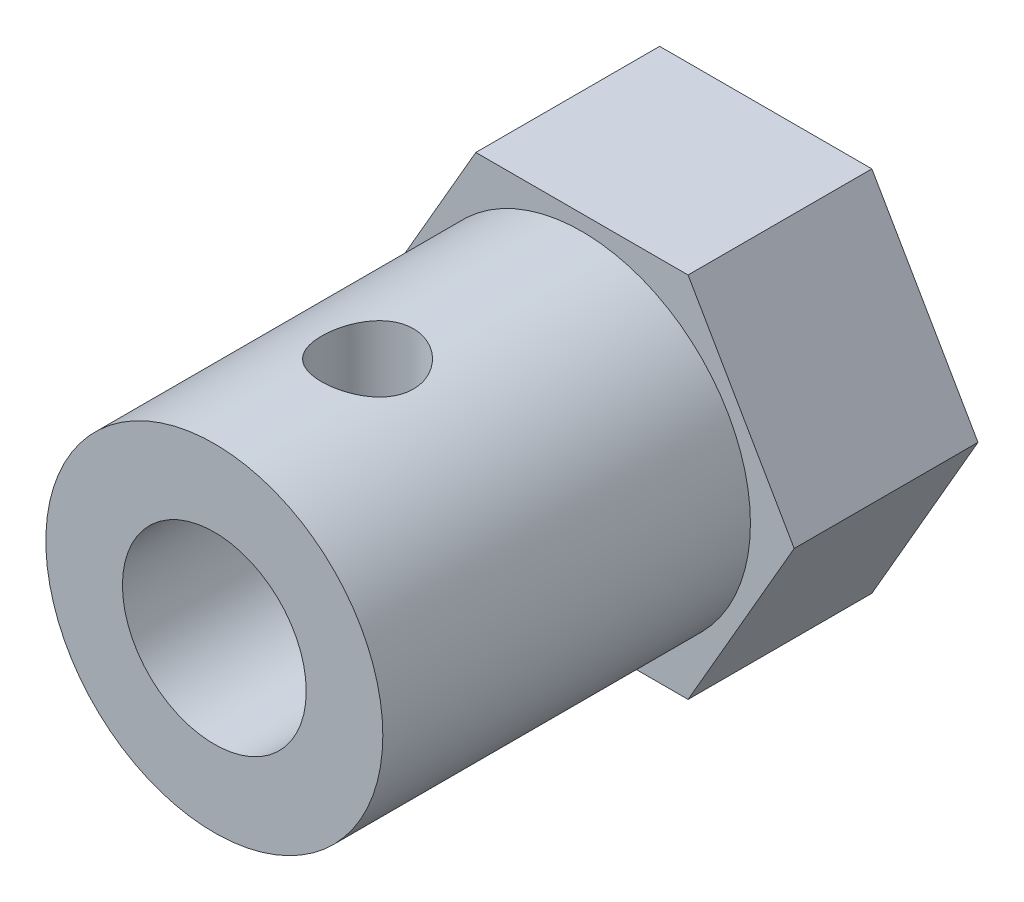
ISO-10303-21;
HEADER;
FILE_DESCRIPTION(('STEP AP214'),'2;1');
FILE_NAME('part.step','',(''),(''),'','','');
FILE_SCHEMA(('AUTOMOTIVE_DESIGN { 1 0 10303 214 1 1 1 1 }'));
ENDSEC;
DATA;
#1=APPLICATION_CONTEXT('core data for automotive mechanical design processes');
#2=APPLICATION_PROTOCOL_DEFINITION('international standard','automotive_design',2000,#1);
#3=PRODUCT_CONTEXT('',#1,'mechanical');
#4=PRODUCT('Part','Part','',(#3));
#5=PRODUCT_RELATED_PRODUCT_CATEGORY('part','',(#4));
#6=PRODUCT_DEFINITION_FORMATION('','',#4);
#7=PRODUCT_DEFINITION_CONTEXT('part definition',#1,'design');
#8=PRODUCT_DEFINITION('design','',#6,#7);
#9=PRODUCT_DEFINITION_SHAPE('','',#8);
#10=(LENGTH_UNIT() NAMED_UNIT(*) SI_UNIT(.MILLI.,.METRE.));
#11=(NAMED_UNIT(*) PLANE_ANGLE_UNIT() SI_UNIT($,.RADIAN.));
#12=(NAMED_UNIT(*) SI_UNIT($,.STERADIAN.) SOLID_ANGLE_UNIT());
#13=UNCERTAINTY_MEASURE_WITH_UNIT(LENGTH_MEASURE(1.E-05),#10,'distance_accuracy_value','');
#14=(GEOMETRIC_REPRESENTATION_CONTEXT(3) GLOBAL_UNCERTAINTY_ASSIGNED_CONTEXT((#13)) GLOBAL_UNIT_ASSIGNED_CONTEXT((#10,
#11,#12)) REPRESENTATION_CONTEXT('',''));
#15=CARTESIAN_POINT('',(0.,0.,0.));
#16=DIRECTION('',(0.,0.,1.));
#17=DIRECTION('',(1.,0.,0.));
#18=AXIS2_PLACEMENT_3D('',#15,#16,#17);
#19=CARTESIAN_POINT('',(0.,0.,18.));
#20=DIRECTION('',(0.,0.,-1.));
#21=DIRECTION('',(-1.,0.,0.));
#22=AXIS2_PLACEMENT_3D('',#19,#20,#21);
#23=CYLINDRICAL_SURFACE('',#22,5.5);
#24=CARTESIAN_POINT('',(0.,0.,18.));
#25=DIRECTION('',(0.,0.,1.));
#26=DIRECTION('',(1.,0.,0.));
#27=AXIS2_PLACEMENT_3D('',#24,#25,#26);
#28=CIRCLE('',#27,5.5);
#29=CARTESIAN_POINT('',(5.5,0.,18.));
#30=VERTEX_POINT('',#29);
#31=EDGE_CURVE('E128',#30,#30,#28,.T.);
#32=ORIENTED_EDGE('',*,*,#31,.F.);
#33=EDGE_LOOP('',(#32));
#34=FACE_BOUND('',#33,.T.);
#35=CARTESIAN_POINT('',(0.,0.,6.));
#36=DIRECTION('',(0.,0.,1.));
#37=DIRECTION('',(1.,0.,0.));
#38=AXIS2_PLACEMENT_3D('',#35,#36,#37);
#39=CIRCLE('',#38,5.5);
#40=CARTESIAN_POINT('',(5.5,0.,6.));
#41=VERTEX_POINT('',#40);
#42=EDGE_CURVE('E206',#41,#41,#39,.T.);
#43=ORIENTED_EDGE('',*,*,#42,.T.);
#44=EDGE_LOOP('',(#43));
#45=FACE_BOUND('',#44,.T.);
#46=CARTESIAN_POINT('',(0.,5.5,11.5));
#47=CARTESIAN_POINT('',(-0.0826209133321935,5.49999882717412,11.500001812611));
#48=CARTESIAN_POINT('',(-0.165260978812708,5.49812007260761,11.5068490635834));
#49=CARTESIAN_POINT('',(-0.328155930157697,5.49080798085451,11.5340058303032));
#50=CARTESIAN_POINT('',(-0.408409727977265,5.48537304740499,11.5543213916286));
#51=CARTESIAN_POINT('',(-0.564157626055394,5.47154772174135,11.6077017317384));
#52=CARTESIAN_POINT('',(-0.639657866970162,5.46316123869395,11.6407496526619));
#53=CARTESIAN_POINT('',(-0.784044496159719,5.44431654412848,11.7185929326624));
#54=CARTESIAN_POINT('',(-0.852930363289776,5.43385816956517,11.7633892163539));
#55=CARTESIAN_POINT('',(-0.983796947573261,5.41171397042059,11.8645998364673));
#56=CARTESIAN_POINT('',(-1.04559512916994,5.4000064149043,11.9212454408542));
#57=CARTESIAN_POINT('',(-1.15894293682478,5.37682112935063,12.0440526360299));
#58=CARTESIAN_POINT('',(-1.21049117824721,5.36534343055203,12.1102155104023));
#59=CARTESIAN_POINT('',(-1.30277794539497,5.34369384163659,12.2516512475795));
#60=CARTESIAN_POINT('',(-1.34330426837586,5.33354930058623,12.3270671449363));
#61=CARTESIAN_POINT('',(-1.41102916361228,5.31603507411917,12.4839638281994));
#62=CARTESIAN_POINT('',(-1.43823031946844,5.30866485085754,12.5654434348885));
#63=CARTESIAN_POINT('',(-1.47789456441268,5.2977584719274,12.7301278950125));
#64=CARTESIAN_POINT('',(-1.49068960543229,5.29413612283787,12.8132469481619));
#65=CARTESIAN_POINT('',(-1.50221364409134,5.29087829084083,12.9805246830088));
#66=CARTESIAN_POINT('',(-1.50094540140882,5.2912420257326,13.0646831575));
#67=CARTESIAN_POINT('',(-1.48464191780301,5.29583824875456,13.2290415509663));
#68=CARTESIAN_POINT('',(-1.47001073668932,5.29995718313671,13.3092852346022));
#69=CARTESIAN_POINT('',(-1.42804483871807,5.3114175579406,13.4661332860228));
#70=CARTESIAN_POINT('',(-1.40070906504647,5.31875926644153,13.5427373504663));
#71=CARTESIAN_POINT('',(-1.3337862982647,5.33593618292326,13.6911735205475));
#72=CARTESIAN_POINT('',(-1.29405951882948,5.34579959764141,13.7629392010336));
#73=CARTESIAN_POINT('',(-1.20357988022174,5.36689368797792,13.8989264474097));
#74=CARTESIAN_POINT('',(-1.15282476106209,5.37812464363249,13.9631464628387));
#75=CARTESIAN_POINT('',(-1.03967346682896,5.40115894990605,14.0845251898064));
#76=CARTESIAN_POINT('',(-0.976938646167252,5.41296874297114,14.1413674492889));
#77=CARTESIAN_POINT('',(-0.842682011788637,5.43548647707978,14.2437909649778));
#78=CARTESIAN_POINT('',(-0.771159819718555,5.44619437064292,14.2893717360496));
#79=CARTESIAN_POINT('',(-0.620853953739625,5.46537278121261,14.3681266727749));
#80=CARTESIAN_POINT('',(-0.542037637417774,5.47383251287305,14.4012413385839));
#81=CARTESIAN_POINT('',(-0.379672688714391,5.48748356142612,14.4536579725141));
#82=CARTESIAN_POINT('',(-0.296125144317683,5.49267562644564,14.4729631024441));
#83=CARTESIAN_POINT('',(-0.129368170483251,5.49909228776313,14.496710617797));
#84=CARTESIAN_POINT('',(-0.0462242977839804,5.50043163125371,14.5015829953204));
#85=CARTESIAN_POINT('',(0.119693365637972,5.49932301585136,14.4975172524866));
#86=CARTESIAN_POINT('',(0.202467195532507,5.49687546782998,14.4885806303835));
#87=CARTESIAN_POINT('',(0.363745097739555,5.48854239265957,14.4575024972969));
#88=CARTESIAN_POINT('',(0.442299324272676,5.48271986472129,14.435602807243));
#89=CARTESIAN_POINT('',(0.59460986744863,5.46829923535645,14.3795027553595));
#90=CARTESIAN_POINT('',(0.668365651304995,5.45970082634473,14.3453010303387));
#91=CARTESIAN_POINT('',(0.810641161194589,5.44041573828275,14.2647835577143));
#92=CARTESIAN_POINT('',(0.879024602412583,5.4296902954988,14.2182365127384));
#93=CARTESIAN_POINT('',(1.00716022013082,5.40738988410035,14.1146387124548));
#94=CARTESIAN_POINT('',(1.06691060617763,5.39581474001048,14.0575857838425));
#95=CARTESIAN_POINT('',(1.17791060344312,5.37269401558495,13.9325859619651));
#96=CARTESIAN_POINT('',(1.22885627747222,5.36115944983886,13.864366617721));
#97=CARTESIAN_POINT('',(1.3185858220796,5.33980026187814,13.7201013527807));
#98=CARTESIAN_POINT('',(1.35737017925923,5.32997557125461,13.6440557453925));
#99=CARTESIAN_POINT('',(1.42138558317209,5.31326248703816,13.486659371758));
#100=CARTESIAN_POINT('',(1.44669352306985,5.30635748202252,13.4053417394748));
#101=CARTESIAN_POINT('',(1.48320917220692,5.29626814696188,13.2393831619724));
#102=CARTESIAN_POINT('',(1.49442068863148,5.29308281231876,13.1547431204463));
#103=CARTESIAN_POINT('',(1.50219895576908,5.29088009671763,12.9876615961825));
#104=CARTESIAN_POINT('',(1.49925533217026,5.29172336001588,12.9052444112775));
#105=CARTESIAN_POINT('',(1.47994837643976,5.29715501736986,12.742129352265));
#106=CARTESIAN_POINT('',(1.46358542028567,5.30174330649891,12.661431430053));
#107=CARTESIAN_POINT('',(1.41819408435119,5.31406316491799,12.5046936842239));
#108=CARTESIAN_POINT('',(1.38927395449127,5.32176783125817,12.4286202467582));
#109=CARTESIAN_POINT('',(1.31967304541386,5.33945189987963,12.2823467231867));
#110=CARTESIAN_POINT('',(1.27899034504456,5.34943167369227,12.2121475989348));
#111=CARTESIAN_POINT('',(1.18555430984851,5.37092379381814,12.0772894023074));
#112=CARTESIAN_POINT('',(1.13246901822125,5.38247375845259,12.0128662951569));
#113=CARTESIAN_POINT('',(1.01636011199274,5.40559990490855,11.8936835932054));
#114=CARTESIAN_POINT('',(0.953334059387995,5.41717609247304,11.8389263759947));
#115=CARTESIAN_POINT('',(0.817407725686079,5.43936459177359,11.7394053854806));
#116=CARTESIAN_POINT('',(0.744315866262519,5.44994907753807,11.694896519133));
#117=CARTESIAN_POINT('',(0.591399899839279,5.46865263780403,11.6188675637885));
#118=CARTESIAN_POINT('',(0.511579952421221,5.47677322151197,11.5873395194457));
#119=CARTESIAN_POINT('',(0.360100101218211,5.48864193995757,11.542060490021));
#120=CARTESIAN_POINT('',(0.289064640262468,5.49286947681091,11.5263254487583));
#121=CARTESIAN_POINT('',(0.145357607941484,5.49854887164354,11.5052949746812));
#122=CARTESIAN_POINT('',(0.0726862155649467,5.5000010318002,11.4999984053452));
#123=CARTESIAN_POINT('',(0.,5.5,11.5));
#124=B_SPLINE_CURVE_WITH_KNOTS('',3,(#46,#47,#48,#49,#50,#51,#52,#53,#54,#55,#56,#57,#58,#59,
#60,#61,#62,#63,#64,#65,#66,#67,#68,#69,#70,#71,#72,#73,#74,#75,#76,#77,#78,#79,#80,#81,#82,#83,
#84,#85,#86,#87,#88,#89,#90,#91,#92,#93,#94,#95,#96,#97,#98,#99,#100,#101,#102,#103,#104,#105,
#106,#107,#108,#109,#110,#111,#112,#113,#114,#115,#116,#117,#118,#119,#120,#121,#122,#123),
.UNSPECIFIED.,.T.,.F.,(4,2,2,2,2,2,2,2,2,2,2,2,2,2,2,2,2,2,2,2,2,2,2,2,2,2,2,2,2,2,2,2,2,2,2,2,
2,2,4),(0.,0.247596106854897,0.4953034285513,0.742683902420578,0.990083851364705,
1.24285878223179,1.49566783659324,1.75304593650219,2.01037411390996,2.26164304860926,
2.51286267696538,2.75672886674887,3.00061534583717,3.24735926767928,3.49415380139121,
3.74938528550775,4.00462776284424,4.26107349736028,4.51746049766944,4.76612811343083,
5.0147687510525,5.25891111200195,5.50308053475836,5.75219469009681,6.00136043656003,
6.2579007306487,6.51443075867912,6.76948096455404,7.0244622712421,7.27068852228629,
7.51690787489588,7.76104555655817,8.00522313517586,8.25689011392092,8.50861891104974,
8.76605872289059,9.02334052607436,9.2411883209319,9.45901239561305),.UNSPECIFIED.);
#125=CARTESIAN_POINT('',(0.,5.5,11.5));
#126=VERTEX_POINT('',#125);
#127=EDGE_CURVE('E174',#126,#126,#124,.T.);
#128=ORIENTED_EDGE('',*,*,#127,.F.);
#129=EDGE_LOOP('',(#128));
#130=FACE_BOUND('',#129,.T.);
#131=ADVANCED_FACE('F34',(#34,#45,#130),#23,.T.);
#132=CARTESIAN_POINT('',(0.,0.,5.));
#133=DIRECTION('',(0.,0.,1.));
#134=DIRECTION('',(1.,0.,0.));
#135=AXIS2_PLACEMENT_3D('',#132,#133,#134);
#136=CYLINDRICAL_SURFACE('',#135,3.);
#137=CARTESIAN_POINT('',(0.,0.,5.));
#138=DIRECTION('',(0.,0.,1.));
#139=DIRECTION('',(1.,0.,0.));
#140=AXIS2_PLACEMENT_3D('',#137,#138,#139);
#141=CIRCLE('',#140,3.);
#142=CARTESIAN_POINT('',(3.,0.,5.));
#143=VERTEX_POINT('',#142);
#144=EDGE_CURVE('E205',#143,#143,#141,.T.);
#145=ORIENTED_EDGE('',*,*,#144,.F.);
#146=EDGE_LOOP('',(#145));
#147=FACE_BOUND('',#146,.T.);
#148=CARTESIAN_POINT('',(0.,0.,18.));
#149=DIRECTION('',(0.,0.,1.));
#150=DIRECTION('',(1.,0.,0.));
#151=AXIS2_PLACEMENT_3D('',#148,#149,#150);
#152=CIRCLE('',#151,3.);
#153=CARTESIAN_POINT('',(3.,0.,18.));
#154=VERTEX_POINT('',#153);
#155=EDGE_CURVE('E207',#154,#154,#152,.T.);
#156=ORIENTED_EDGE('',*,*,#155,.T.);
#157=EDGE_LOOP('',(#156));
#158=FACE_BOUND('',#157,.T.);
#159=CARTESIAN_POINT('',(0.,3.,11.5));
#160=CARTESIAN_POINT('',(0.0788579444268502,2.99999570107561,11.5000049534758));
#161=CARTESIAN_POINT('',(0.157809899546344,2.99685736529634,11.5062551096816));
#162=CARTESIAN_POINT('',(0.313380352903344,2.98461234055736,11.5309793205123));
#163=CARTESIAN_POINT('',(0.389994130070444,2.97549431743379,11.5494765894967));
#164=CARTESIAN_POINT('',(0.538400317320673,2.95224419105063,11.5977907129249));
#165=CARTESIAN_POINT('',(0.610210204408719,2.93813158766306,11.627563576372));
#166=CARTESIAN_POINT('',(0.747708925209898,2.90618664773642,11.6973559320475));
#167=CARTESIAN_POINT('',(0.813398240985089,2.88835460450288,11.7373746163733));
#168=CARTESIAN_POINT('',(0.941261726642864,2.84934387387093,11.8292758742279));
#169=CARTESIAN_POINT('',(1.00298281668316,2.82802798691306,11.8817297188595));
#170=CARTESIAN_POINT('',(1.11716916730047,2.78489955370115,11.9957822188706));
#171=CARTESIAN_POINT('',(1.16962737466015,2.76308664313552,12.0573877776587));
#172=CARTESIAN_POINT('',(1.26787800067542,2.71948426796021,12.1937250242851));
#173=CARTESIAN_POINT('',(1.31283800332745,2.69782780455198,12.2691041475189));
#174=CARTESIAN_POINT('',(1.38925234033604,2.65928968158481,12.4275510039793));
#175=CARTESIAN_POINT('',(1.4207163224495,2.64240461410484,12.5106131930841));
#176=CARTESIAN_POINT('',(1.46719866328288,2.61686800556713,12.6769976581329));
#177=CARTESIAN_POINT('',(1.48308878562066,2.6077840737557,12.7600066781011));
#178=CARTESIAN_POINT('',(1.50064048996327,2.59772834922792,12.9279682566692));
#179=CARTESIAN_POINT('',(1.50231613255961,2.59674854014932,13.0129188113067));
#180=CARTESIAN_POINT('',(1.49203093075844,2.60266395385873,13.1714290364731));
#181=CARTESIAN_POINT('',(1.48167683930523,2.6086314549302,13.2451360468346));
#182=CARTESIAN_POINT('',(1.4504097735854,2.62614343100775,13.3895828640596));
#183=CARTESIAN_POINT('',(1.42949343584648,2.63768968247664,13.460321717958));
#184=CARTESIAN_POINT('',(1.37731467057901,2.66531214619112,13.5988436988485));
#185=CARTESIAN_POINT('',(1.34582260067399,2.68148760995998,13.6665195981787));
#186=CARTESIAN_POINT('',(1.273562531502,2.71655106422106,13.795951438885));
#187=CARTESIAN_POINT('',(1.2327903657187,2.73544027170286,13.8577047034001));
#188=CARTESIAN_POINT('',(1.13709908236918,2.77669736854929,13.9817818791148));
#189=CARTESIAN_POINT('',(1.08104168755392,2.79920265355119,14.0431853103642));
#190=CARTESIAN_POINT('',(0.95933336811206,2.84321434950611,14.1561031278864));
#191=CARTESIAN_POINT('',(0.893677884861428,2.86472027938201,14.2076127880508));
#192=CARTESIAN_POINT('',(0.750774758747773,2.90552980924446,14.3015284915446));
#193=CARTESIAN_POINT('',(0.673130387399114,2.92468476243011,14.3434007086686));
#194=CARTESIAN_POINT('',(0.510699323233195,2.95736821681863,14.4131455435645));
#195=CARTESIAN_POINT('',(0.425918364397914,2.9709011841533,14.4410292775227));
#196=CARTESIAN_POINT('',(0.259149737491054,2.98986500612153,14.479713105575));
#197=CARTESIAN_POINT('',(0.177512295822489,2.99587407451965,14.4917368536202));
#198=CARTESIAN_POINT('',(0.0131693999240272,3.00109520188655,14.5021970967017));
#199=CARTESIAN_POINT('',(-0.0695355298048634,3.00031048081978,14.5006400284592));
#200=CARTESIAN_POINT('',(-0.22684945797898,2.99236788380152,14.4846899673719));
#201=CARTESIAN_POINT('',(-0.301589112074895,2.98570868532252,14.471301200905));
#202=CARTESIAN_POINT('',(-0.447610338452912,2.9673325697226,14.4336428921573));
#203=CARTESIAN_POINT('',(-0.518891528536631,2.95561509501618,14.4093721503198));
#204=CARTESIAN_POINT('',(-0.65833291267436,2.92776377120382,14.3500023003504));
#205=CARTESIAN_POINT('',(-0.726345595508705,2.91151322654446,14.3146134248256));
#206=CARTESIAN_POINT('',(-0.855692042548908,2.87615961476126,14.2343386965301));
#207=CARTESIAN_POINT('',(-0.917022944664888,2.85705533350407,14.1894487981069));
#208=CARTESIAN_POINT('',(-1.03765153393382,2.81562332004297,14.0863593620039));
#209=CARTESIAN_POINT('',(-1.09615811672854,2.79316327265249,14.0272856973323));
#210=CARTESIAN_POINT('',(-1.20278448167828,2.7489358741323,13.9001122730834));
#211=CARTESIAN_POINT('',(-1.25089707856781,2.72716901100071,13.8320063217281));
#212=CARTESIAN_POINT('',(-1.33756187171853,2.68576788309734,13.6845345187405));
#213=CARTESIAN_POINT('',(-1.37553824370037,2.66628794383591,13.6047831008583));
#214=CARTESIAN_POINT('',(-1.43712423890206,2.63361108441202,13.4387348986376));
#215=CARTESIAN_POINT('',(-1.46075237380052,2.62040607332625,13.3524467102997));
#216=CARTESIAN_POINT('',(-1.49079253120031,2.60342251538703,13.1846346656729));
#217=CARTESIAN_POINT('',(-1.49863949460818,2.59886075197597,13.1034486198471));
#218=CARTESIAN_POINT('',(-1.5010337315643,2.59748031962405,12.9408293992532));
#219=CARTESIAN_POINT('',(-1.49558676993486,2.60065829439585,12.8593963468932));
#220=CARTESIAN_POINT('',(-1.47288918838996,2.61356793076615,12.7067747476998));
#221=CARTESIAN_POINT('',(-1.45681247151455,2.62264641723988,12.6353492947829));
#222=CARTESIAN_POINT('',(-1.41476303733662,2.64556524281479,12.4962878208634));
#223=CARTESIAN_POINT('',(-1.38878713673988,2.65940711354503,12.428653026862));
#224=CARTESIAN_POINT('',(-1.32572361795085,2.69142795546804,12.2940627235202));
#225=CARTESIAN_POINT('',(-1.28800670672355,2.70983583593881,12.2274581472565));
#226=CARTESIAN_POINT('',(-1.20322645745609,2.74852997452291,12.1010881957281));
#227=CARTESIAN_POINT('',(-1.15615825686234,2.76881720693416,12.0413264042183));
#228=CARTESIAN_POINT('',(-1.04730498999206,2.81193484737138,11.922787026468));
#229=CARTESIAN_POINT('',(-0.984426634495891,2.83477474959942,11.8650113464746));
#230=CARTESIAN_POINT('',(-0.849232209349795,2.87816628389896,11.7606055248471));
#231=CARTESIAN_POINT('',(-0.776911084957795,2.89871667939293,11.7139813907951));
#232=CARTESIAN_POINT('',(-0.623897395174417,2.93547014349806,11.6331454559319));
#233=CARTESIAN_POINT('',(-0.543149255665094,2.95164144740899,11.5990237461453));
#234=CARTESIAN_POINT('',(-0.376113151707128,2.9775201194848,11.5452877483639));
#235=CARTESIAN_POINT('',(-0.289841699383648,2.98724585044602,11.5256322297914));
#236=CARTESIAN_POINT('',(-0.168902919736341,2.99543192870217,11.5091538833714));
#237=CARTESIAN_POINT('',(-0.135242819162346,2.99714048010376,11.5057260387005));
#238=CARTESIAN_POINT('',(-0.0677275977076369,2.99942545465223,11.5011480017289));
#239=CARTESIAN_POINT('',(-0.0338724714699424,3.00000184655071,11.4999978722947));
#240=CARTESIAN_POINT('',(0.,3.,11.5));
#241=B_SPLINE_CURVE_WITH_KNOTS('',3,(#159,#160,#161,#162,#163,#164,#165,#166,#167,#168,#169,
#170,#171,#172,#173,#174,#175,#176,#177,#178,#179,#180,#181,#182,#183,#184,#185,#186,#187,#188,
#189,#190,#191,#192,#193,#194,#195,#196,#197,#198,#199,#200,#201,#202,#203,#204,#205,#206,#207,
#208,#209,#210,#211,#212,#213,#214,#215,#216,#217,#218,#219,#220,#221,#222,#223,#224,#225,#226,
#227,#228,#229,#230,#231,#232,#233,#234,#235,#236,#237,#238,#239,#240),.UNSPECIFIED.,.T.,.F.,(4,
2,2,2,2,2,2,2,2,2,2,2,2,2,2,2,2,2,2,2,2,2,2,2,2,2,2,2,2,2,2,2,2,2,2,2,2,2,2,2,4),(0.,
0.236436386130439,0.473322224563796,0.709293233238447,0.945245640872351,1.19547263807713,
1.44588935648105,1.71572589646129,1.98536921847421,2.23887018210344,2.49212035993531,
2.7150856861398,2.93812205888518,3.16635360252731,3.39468781890333,3.65197412000818,
3.90938301898029,4.17874533321661,4.44789325368419,4.69474935707018,4.94148846767214,
5.16910359759183,5.39674382446397,5.63089284041848,5.86514176122509,6.12239415966628,
6.37982382923148,6.64972023242589,6.91926767918176,7.1629396125457,7.40650589797017,
7.62686895373284,7.84730293182526,8.08254685170431,8.31791341715446,8.58187864135757,
8.84598575071868,9.1119602049529,9.37717362931723,9.47872920200875,9.58028757766598),.UNSPECIFIED.);
#242=CARTESIAN_POINT('',(0.,3.,11.5));
#243=VERTEX_POINT('',#242);
#244=EDGE_CURVE('E38',#243,#243,#241,.T.);
#245=ORIENTED_EDGE('',*,*,#244,.F.);
#246=EDGE_LOOP('',(#245));
#247=FACE_BOUND('',#246,.T.);
#248=ADVANCED_FACE('F161',(#147,#158,#247),#136,.F.);
#249=CARTESIAN_POINT('',(3.46410161513776,-6.,6.));
#250=DIRECTION('',(-0.866025403784439,0.5,0.));
#251=DIRECTION('',(-0.5,-0.866025403784439,0.));
#252=AXIS2_PLACEMENT_3D('',#249,#250,#251);
#253=PLANE('',#252);
#254=DIRECTION('',(0.5,0.866025403784439,0.));
#255=VECTOR('',#254,1.);
#256=CARTESIAN_POINT('',(3.46410161513776,-6.,0.));
#257=LINE('',#256,#255);
#258=CARTESIAN_POINT('',(3.46410161513776,-6.,0.));
#259=VERTEX_POINT('',#258);
#260=CARTESIAN_POINT('',(6.92820323027551,0.,0.));
#261=VERTEX_POINT('',#260);
#262=EDGE_CURVE('E124',#259,#261,#257,.T.);
#263=ORIENTED_EDGE('',*,*,#262,.T.);
#264=DIRECTION('',(0.,0.,-1.));
#265=VECTOR('',#264,1.);
#266=CARTESIAN_POINT('',(6.92820323027551,0.,6.));
#267=LINE('',#266,#265);
#268=CARTESIAN_POINT('',(6.92820323027551,0.,6.));
#269=VERTEX_POINT('',#268);
#270=EDGE_CURVE('E11',#269,#261,#267,.T.);
#271=ORIENTED_EDGE('',*,*,#270,.F.);
#272=DIRECTION('',(0.5,0.866025403784439,0.));
#273=VECTOR('',#272,1.);
#274=CARTESIAN_POINT('',(3.46410161513776,-6.,6.));
#275=LINE('',#274,#273);
#276=CARTESIAN_POINT('',(3.46410161513776,-6.,6.));
#277=VERTEX_POINT('',#276);
#278=EDGE_CURVE('E135',#277,#269,#275,.T.);
#279=ORIENTED_EDGE('',*,*,#278,.F.);
#280=DIRECTION('',(0.,0.,-1.));
#281=VECTOR('',#280,1.);
#282=CARTESIAN_POINT('',(3.46410161513776,-6.,6.));
#283=LINE('',#282,#281);
#284=EDGE_CURVE('E120',#277,#259,#283,.T.);
#285=ORIENTED_EDGE('',*,*,#284,.T.);
#286=EDGE_LOOP('',(#263,#271,#279,#285));
#287=FACE_BOUND('',#286,.T.);
#288=ADVANCED_FACE('F36',(#287),#253,.F.);
#289=CARTESIAN_POINT('',(6.92820323027551,0.,6.));
#290=DIRECTION('',(-0.866025403784438,-0.5,0.));
#291=DIRECTION('',(0.5,-0.866025403784439,0.));
#292=AXIS2_PLACEMENT_3D('',#289,#290,#291);
#293=PLANE('',#292);
#294=DIRECTION('',(-0.5,0.866025403784439,0.));
#295=VECTOR('',#294,1.);
#296=CARTESIAN_POINT('',(6.92820323027551,0.,0.));
#297=LINE('',#296,#295);
#298=CARTESIAN_POINT('',(3.46410161513775,6.,0.));
#299=VERTEX_POINT('',#298);
#300=EDGE_CURVE('E127',#261,#299,#297,.T.);
#301=ORIENTED_EDGE('',*,*,#300,.T.);
#302=DIRECTION('',(0.,0.,-1.));
#303=VECTOR('',#302,1.);
#304=CARTESIAN_POINT('',(3.46410161513775,6.,6.));
#305=LINE('',#304,#303);
#306=CARTESIAN_POINT('',(3.46410161513775,6.,6.));
#307=VERTEX_POINT('',#306);
#308=EDGE_CURVE('E48',#307,#299,#305,.T.);
#309=ORIENTED_EDGE('',*,*,#308,.F.);
#310=DIRECTION('',(-0.5,0.866025403784439,0.));
#311=VECTOR('',#310,1.);
#312=CARTESIAN_POINT('',(6.92820323027551,0.,6.));
#313=LINE('',#312,#311);
#314=EDGE_CURVE('E93',#269,#307,#313,.T.);
#315=ORIENTED_EDGE('',*,*,#314,.F.);
#316=ORIENTED_EDGE('',*,*,#270,.T.);
#317=EDGE_LOOP('',(#301,#309,#315,#316));
#318=FACE_BOUND('',#317,.T.);
#319=ADVANCED_FACE('F263',(#318),#293,.F.);
#320=CARTESIAN_POINT('',(3.46410161513775,6.,6.));
#321=DIRECTION('',(0.,-1.,0.));
#322=DIRECTION('',(0.,0.,-1.));
#323=AXIS2_PLACEMENT_3D('',#320,#321,#322);
#324=PLANE('',#323);
#325=DIRECTION('',(-1.,0.,0.));
#326=VECTOR('',#325,1.);
#327=CARTESIAN_POINT('',(3.46410161513775,6.,0.));
#328=LINE('',#327,#326);
#329=CARTESIAN_POINT('',(-3.46410161513775,6.,0.));
#330=VERTEX_POINT('',#329);
#331=EDGE_CURVE('E130',#299,#330,#328,.T.);
#332=ORIENTED_EDGE('',*,*,#331,.T.);
#333=DIRECTION('',(0.,0.,-1.));
#334=VECTOR('',#333,1.);
#335=CARTESIAN_POINT('',(-3.46410161513775,6.,6.));
#336=LINE('',#335,#334);
#337=CARTESIAN_POINT('',(-3.46410161513775,6.,6.));
#338=VERTEX_POINT('',#337);
#339=EDGE_CURVE('E115',#338,#330,#336,.T.);
#340=ORIENTED_EDGE('',*,*,#339,.F.);
#341=DIRECTION('',(-1.,0.,0.));
#342=VECTOR('',#341,1.);
#343=CARTESIAN_POINT('',(3.46410161513775,6.,6.));
#344=LINE('',#343,#342);
#345=EDGE_CURVE('E106',#307,#338,#344,.T.);
#346=ORIENTED_EDGE('',*,*,#345,.F.);
#347=ORIENTED_EDGE('',*,*,#308,.T.);
#348=EDGE_LOOP('',(#332,#340,#346,#347));
#349=FACE_BOUND('',#348,.T.);
#350=ADVANCED_FACE('F142',(#349),#324,.F.);
#351=CARTESIAN_POINT('',(-3.46410161513775,6.,6.));
#352=DIRECTION('',(0.866025403784439,-0.5,0.));
#353=DIRECTION('',(0.5,0.866025403784439,0.));
#354=AXIS2_PLACEMENT_3D('',#351,#352,#353);
#355=PLANE('',#354);
#356=DIRECTION('',(-0.5,-0.866025403784439,0.));
#357=VECTOR('',#356,1.);
#358=CARTESIAN_POINT('',(-3.46410161513775,6.,0.));
#359=LINE('',#358,#357);
#360=CARTESIAN_POINT('',(-6.92820323027551,0.,0.));
#361=VERTEX_POINT('',#360);
#362=EDGE_CURVE('E114',#330,#361,#359,.T.);
#363=ORIENTED_EDGE('',*,*,#362,.T.);
#364=DIRECTION('',(0.,0.,-1.));
#365=VECTOR('',#364,1.);
#366=CARTESIAN_POINT('',(-6.92820323027551,0.,6.));
#367=LINE('',#366,#365);
#368=CARTESIAN_POINT('',(-6.92820323027551,0.,6.));
#369=VERTEX_POINT('',#368);
#370=EDGE_CURVE('E111',#369,#361,#367,.T.);
#371=ORIENTED_EDGE('',*,*,#370,.F.);
#372=DIRECTION('',(-0.5,-0.866025403784439,0.));
#373=VECTOR('',#372,1.);
#374=CARTESIAN_POINT('',(-3.46410161513775,6.,6.));
#375=LINE('',#374,#373);
#376=EDGE_CURVE('E100',#338,#369,#375,.T.);
#377=ORIENTED_EDGE('',*,*,#376,.F.);
#378=ORIENTED_EDGE('',*,*,#339,.T.);
#379=EDGE_LOOP('',(#363,#371,#377,#378));
#380=FACE_BOUND('',#379,.T.);
#381=ADVANCED_FACE('F112',(#380),#355,.F.);
#382=CARTESIAN_POINT('',(-6.92820323027551,0.,6.));
#383=DIRECTION('',(0.866025403784439,0.5,0.));
#384=DIRECTION('',(-0.5,0.866025403784439,0.));
#385=AXIS2_PLACEMENT_3D('',#382,#383,#384);
#386=PLANE('',#385);
#387=DIRECTION('',(0.5,-0.866025403784439,0.));
#388=VECTOR('',#387,1.);
#389=CARTESIAN_POINT('',(-6.92820323027551,0.,0.));
#390=LINE('',#389,#388);
#391=CARTESIAN_POINT('',(-3.46410161513775,-6.,0.));
#392=VERTEX_POINT('',#391);
#393=EDGE_CURVE('E79',#361,#392,#390,.T.);
#394=ORIENTED_EDGE('',*,*,#393,.T.);
#395=DIRECTION('',(0.,0.,-1.));
#396=VECTOR('',#395,1.);
#397=CARTESIAN_POINT('',(-3.46410161513775,-6.,6.));
#398=LINE('',#397,#396);
#399=CARTESIAN_POINT('',(-3.46410161513775,-6.,6.));
#400=VERTEX_POINT('',#399);
#401=EDGE_CURVE('E116',#400,#392,#398,.T.);
#402=ORIENTED_EDGE('',*,*,#401,.F.);
#403=DIRECTION('',(0.5,-0.866025403784439,0.));
#404=VECTOR('',#403,1.);
#405=CARTESIAN_POINT('',(-6.92820323027551,0.,6.));
#406=LINE('',#405,#404);
#407=EDGE_CURVE('E104',#369,#400,#406,.T.);
#408=ORIENTED_EDGE('',*,*,#407,.F.);
#409=ORIENTED_EDGE('',*,*,#370,.T.);
#410=EDGE_LOOP('',(#394,#402,#408,#409));
#411=FACE_BOUND('',#410,.T.);
#412=ADVANCED_FACE('F118',(#411),#386,.F.);
#413=CARTESIAN_POINT('',(-3.46410161513775,-6.,6.));
#414=DIRECTION('',(0.,1.,0.));
#415=DIRECTION('',(-1.,0.,0.));
#416=AXIS2_PLACEMENT_3D('',#413,#414,#415);
#417=PLANE('',#416);
#418=DIRECTION('',(1.,0.,0.));
#419=VECTOR('',#418,1.);
#420=CARTESIAN_POINT('',(-3.46410161513775,-6.,0.));
#421=LINE('',#420,#419);
#422=EDGE_CURVE('E85',#392,#259,#421,.T.);
#423=ORIENTED_EDGE('',*,*,#422,.T.);
#424=ORIENTED_EDGE('',*,*,#284,.F.);
#425=DIRECTION('',(1.,0.,0.));
#426=VECTOR('',#425,1.);
#427=CARTESIAN_POINT('',(-3.46410161513775,-6.,6.));
#428=LINE('',#427,#426);
#429=EDGE_CURVE('E56',#400,#277,#428,.T.);
#430=ORIENTED_EDGE('',*,*,#429,.F.);
#431=ORIENTED_EDGE('',*,*,#401,.T.);
#432=EDGE_LOOP('',(#423,#424,#430,#431));
#433=FACE_BOUND('',#432,.T.);
#434=ADVANCED_FACE('F149',(#433),#417,.F.);
#435=CARTESIAN_POINT('',(0.,0.,6.));
#436=DIRECTION('',(0.,0.,1.));
#437=DIRECTION('',(1.,0.,0.));
#438=AXIS2_PLACEMENT_3D('',#435,#436,#437);
#439=PLANE('',#438);
#440=ORIENTED_EDGE('',*,*,#42,.F.);
#441=EDGE_LOOP('',(#440));
#442=FACE_BOUND('',#441,.T.);
#443=ORIENTED_EDGE('',*,*,#278,.T.);
#444=ORIENTED_EDGE('',*,*,#314,.T.);
#445=ORIENTED_EDGE('',*,*,#345,.T.);
#446=ORIENTED_EDGE('',*,*,#376,.T.);
#447=ORIENTED_EDGE('',*,*,#407,.T.);
#448=ORIENTED_EDGE('',*,*,#429,.T.);
#449=EDGE_LOOP('',(#443,#444,#445,#446,#447,#448));
#450=FACE_BOUND('',#449,.T.);
#451=ADVANCED_FACE('F102',(#442,#450),#439,.T.);
#452=CARTESIAN_POINT('',(0.,0.,0.));
#453=DIRECTION('',(0.,0.,1.));
#454=DIRECTION('',(1.,0.,0.));
#455=AXIS2_PLACEMENT_3D('',#452,#453,#454);
#456=PLANE('',#455);
#457=CARTESIAN_POINT('',(0.,0.,0.));
#458=DIRECTION('',(0.,0.,-1.));
#459=DIRECTION('',(-1.,0.,0.));
#460=AXIS2_PLACEMENT_3D('',#457,#458,#459);
#461=CIRCLE('',#460,2.);
#462=CARTESIAN_POINT('',(-2.,0.,0.));
#463=VERTEX_POINT('',#462);
#464=EDGE_CURVE('E179',#463,#463,#461,.T.);
#465=ORIENTED_EDGE('',*,*,#464,.F.);
#466=EDGE_LOOP('',(#465));
#467=FACE_BOUND('',#466,.T.);
#468=ORIENTED_EDGE('',*,*,#262,.F.);
#469=ORIENTED_EDGE('',*,*,#422,.F.);
#470=ORIENTED_EDGE('',*,*,#393,.F.);
#471=ORIENTED_EDGE('',*,*,#362,.F.);
#472=ORIENTED_EDGE('',*,*,#331,.F.);
#473=ORIENTED_EDGE('',*,*,#300,.F.);
#474=EDGE_LOOP('',(#468,#469,#470,#471,#472,#473));
#475=FACE_BOUND('',#474,.T.);
#476=ADVANCED_FACE('F145',(#467,#475),#456,.F.);
#477=CARTESIAN_POINT('',(0.,0.,18.));
#478=DIRECTION('',(0.,0.,1.));
#479=DIRECTION('',(1.,0.,0.));
#480=AXIS2_PLACEMENT_3D('',#477,#478,#479);
#481=PLANE('',#480);
#482=ORIENTED_EDGE('',*,*,#155,.F.);
#483=EDGE_LOOP('',(#482));
#484=FACE_BOUND('',#483,.T.);
#485=ORIENTED_EDGE('',*,*,#31,.T.);
#486=EDGE_LOOP('',(#485));
#487=FACE_BOUND('',#486,.T.);
#488=ADVANCED_FACE('F172',(#484,#487),#481,.T.);
#489=CARTESIAN_POINT('',(0.,0.,5.));
#490=DIRECTION('',(0.,0.,1.));
#491=DIRECTION('',(1.,0.,0.));
#492=AXIS2_PLACEMENT_3D('',#489,#490,#491);
#493=PLANE('',#492);
#494=CARTESIAN_POINT('',(0.,0.,5.));
#495=DIRECTION('',(0.,0.,-1.));
#496=DIRECTION('',(-1.,0.,0.));
#497=AXIS2_PLACEMENT_3D('',#494,#495,#496);
#498=CIRCLE('',#497,2.);
#499=CARTESIAN_POINT('',(-2.,0.,5.));
#500=VERTEX_POINT('',#499);
#501=EDGE_CURVE('E180',#500,#500,#498,.T.);
#502=ORIENTED_EDGE('',*,*,#501,.T.);
#503=EDGE_LOOP('',(#502));
#504=FACE_BOUND('',#503,.T.);
#505=ORIENTED_EDGE('',*,*,#144,.T.);
#506=EDGE_LOOP('',(#505));
#507=FACE_BOUND('',#506,.T.);
#508=ADVANCED_FACE('F191',(#504,#507),#493,.T.);
#509=CARTESIAN_POINT('',(0.,0.,5.));
#510=DIRECTION('',(0.,0.,-1.));
#511=DIRECTION('',(-1.,0.,0.));
#512=AXIS2_PLACEMENT_3D('',#509,#510,#511);
#513=CYLINDRICAL_SURFACE('',#512,2.);
#514=ORIENTED_EDGE('',*,*,#501,.F.);
#515=EDGE_LOOP('',(#514));
#516=FACE_BOUND('',#515,.T.);
#517=ORIENTED_EDGE('',*,*,#464,.T.);
#518=EDGE_LOOP('',(#517));
#519=FACE_BOUND('',#518,.T.);
#520=ADVANCED_FACE('F186',(#516,#519),#513,.F.);
#521=CARTESIAN_POINT('',(0.,12.,13.));
#522=DIRECTION('',(0.,-1.,0.));
#523=DIRECTION('',(0.,0.,-1.));
#524=AXIS2_PLACEMENT_3D('',#521,#522,#523);
#525=CYLINDRICAL_SURFACE('',#524,1.5);
#526=ORIENTED_EDGE('',*,*,#244,.T.);
#527=EDGE_LOOP('',(#526));
#528=FACE_BOUND('',#527,.T.);
#529=ORIENTED_EDGE('',*,*,#127,.T.);
#530=EDGE_LOOP('',(#529));
#531=FACE_BOUND('',#530,.T.);
#532=ADVANCED_FACE('F182',(#528,#531),#525,.F.);
#533=CLOSED_SHELL('',(#131,#248,#288,#319,#350,#381,#412,#434,#451,#476,#488,#508,#520,#532));
#534=MANIFOLD_SOLID_BREP('B2',#533);
#535=ADVANCED_BREP_SHAPE_REPRESENTATION('',(#18,#534),#14);
#536=SHAPE_DEFINITION_REPRESENTATION(#9,#535);
ENDSEC;
END-ISO-10303-21;
